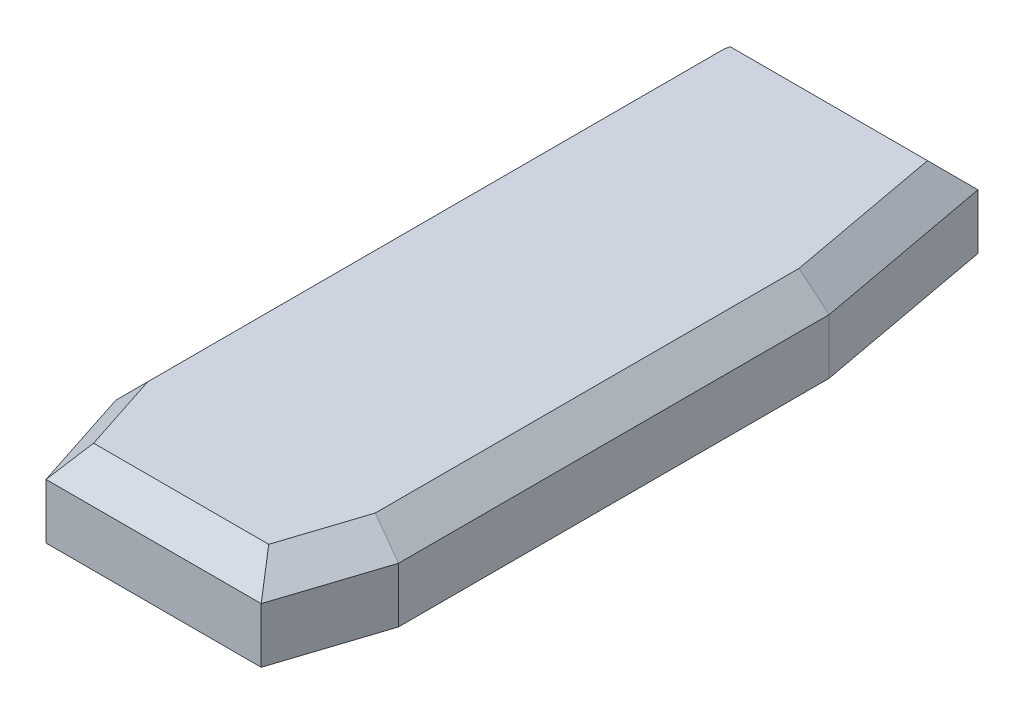
ISO-10303-21;
HEADER;
FILE_DESCRIPTION(('STEP AP214'),'2;1');
FILE_NAME('part.step','',(''),(''),'','','');
FILE_SCHEMA(('AUTOMOTIVE_DESIGN { 1 0 10303 214 1 1 1 1 }'));
ENDSEC;
DATA;
#1=APPLICATION_CONTEXT('core data for automotive mechanical design processes');
#2=APPLICATION_PROTOCOL_DEFINITION('international standard','automotive_design',2000,#1);
#3=PRODUCT_CONTEXT('',#1,'mechanical');
#4=PRODUCT('Part','Part','',(#3));
#5=PRODUCT_RELATED_PRODUCT_CATEGORY('part','',(#4));
#6=PRODUCT_DEFINITION_FORMATION('','',#4);
#7=PRODUCT_DEFINITION_CONTEXT('part definition',#1,'design');
#8=PRODUCT_DEFINITION('design','',#6,#7);
#9=PRODUCT_DEFINITION_SHAPE('','',#8);
#10=(LENGTH_UNIT() NAMED_UNIT(*) SI_UNIT(.MILLI.,.METRE.));
#11=(NAMED_UNIT(*) PLANE_ANGLE_UNIT() SI_UNIT($,.RADIAN.));
#12=(NAMED_UNIT(*) SI_UNIT($,.STERADIAN.) SOLID_ANGLE_UNIT());
#13=UNCERTAINTY_MEASURE_WITH_UNIT(LENGTH_MEASURE(1.E-05),#10,'distance_accuracy_value','');
#14=(GEOMETRIC_REPRESENTATION_CONTEXT(3) GLOBAL_UNCERTAINTY_ASSIGNED_CONTEXT((#13)) GLOBAL_UNIT_ASSIGNED_CONTEXT((#10,
#11,#12)) REPRESENTATION_CONTEXT('',''));
#15=CARTESIAN_POINT('',(0.,0.,0.));
#16=DIRECTION('',(0.,0.,1.));
#17=DIRECTION('',(1.,0.,0.));
#18=AXIS2_PLACEMENT_3D('',#15,#16,#17);
#19=CARTESIAN_POINT('',(-18.0555095571876,6.,-52.));
#20=DIRECTION('',(0.983392157291948,0.,0.18149342956892));
#21=DIRECTION('',(0.18149342956892,0.,-0.983392157291948));
#22=AXIS2_PLACEMENT_3D('',#19,#20,#21);
#23=PLANE('',#22);
#24=DIRECTION('',(-0.18149342956892,0.,0.983392157291948));
#25=VECTOR('',#24,1.);
#26=CARTESIAN_POINT('',(-18.0555095571876,6.,-52.));
#27=LINE('',#26,#25);
#28=CARTESIAN_POINT('',(-18.4246266550272,6.,-50.));
#29=VERTEX_POINT('',#28);
#30=CARTESIAN_POINT('',(-18.5,6.00000000000001,-49.5916019853108));
#31=VERTEX_POINT('',#30);
#32=EDGE_CURVE('E154',#29,#31,#27,.T.);
#33=ORIENTED_EDGE('',*,*,#32,.F.);
#34=DIRECTION('',(-0.129405307426086,0.701161274747102,0.7011612747471));
#35=VECTOR('',#34,1.);
#36=CARTESIAN_POINT('',(-18.1160927655662,4.32826010354525,-51.6717398964548));
#37=LINE('',#36,#35);
#38=CARTESIAN_POINT('',(-18.0555095571876,4.00000000000001,-52.));
#39=VERTEX_POINT('',#38);
#40=EDGE_CURVE('E199',#29,#39,#37,.F.);
#41=ORIENTED_EDGE('',*,*,#40,.T.);
#42=DIRECTION('',(0.,-1.,0.));
#43=VECTOR('',#42,1.);
#44=CARTESIAN_POINT('',(-18.0555095571876,6.,-52.));
#45=LINE('',#44,#43);
#46=CARTESIAN_POINT('',(-18.0555095571876,0.,-52.));
#47=VERTEX_POINT('',#46);
#48=EDGE_CURVE('E148',#39,#47,#45,.T.);
#49=ORIENTED_EDGE('',*,*,#48,.T.);
#50=DIRECTION('',(-0.18149342956892,0.,0.983392157291948));
#51=VECTOR('',#50,1.);
#52=CARTESIAN_POINT('',(-18.0555095571876,0.,-52.));
#53=LINE('',#52,#51);
#54=CARTESIAN_POINT('',(-20.5,0.,-38.7549324747099));
#55=VERTEX_POINT('',#54);
#56=EDGE_CURVE('E141',#47,#55,#53,.T.);
#57=ORIENTED_EDGE('',*,*,#56,.T.);
#58=DIRECTION('',(0.,-1.,0.));
#59=VECTOR('',#58,1.);
#60=CARTESIAN_POINT('',(-20.5,6.,-38.7549324747099));
#61=LINE('',#60,#59);
#62=CARTESIAN_POINT('',(-20.5,4.00000000000001,-38.7549324747099));
#63=VERTEX_POINT('',#62);
#64=EDGE_CURVE('E123',#63,#55,#61,.T.);
#65=ORIENTED_EDGE('',*,*,#64,.F.);
#66=DIRECTION('',(-0.178576122177072,-0.178576122177072,0.967585209258802));
#67=VECTOR('',#66,1.);
#68=CARTESIAN_POINT('',(-27.0688146085232,-2.56881460852318,-3.16289598022375));
#69=LINE('',#68,#67);
#70=EDGE_CURVE('E197',#63,#31,#69,.F.);
#71=ORIENTED_EDGE('',*,*,#70,.T.);
#72=EDGE_LOOP('',(#33,#41,#49,#57,#65,#71));
#73=FACE_BOUND('',#72,.T.);
#74=ADVANCED_FACE('F34',(#73),#23,.F.);
#75=CARTESIAN_POINT('',(-20.5,6.,-7.51056710569006));
#76=DIRECTION('',(1.,0.,0.));
#77=DIRECTION('',(0.,0.,-1.));
#78=AXIS2_PLACEMENT_3D('',#75,#76,#77);
#79=PLANE('',#78);
#80=DIRECTION('',(0.,-1.,0.));
#81=VECTOR('',#80,1.);
#82=CARTESIAN_POINT('',(-20.5,6.,-7.51056710569006));
#83=LINE('',#82,#81);
#84=CARTESIAN_POINT('',(-20.5,4.00000000000001,-7.51056710569006));
#85=VERTEX_POINT('',#84);
#86=CARTESIAN_POINT('',(-20.5,0.,-7.51056710569006));
#87=VERTEX_POINT('',#86);
#88=EDGE_CURVE('E135',#85,#87,#83,.T.);
#89=ORIENTED_EDGE('',*,*,#88,.F.);
#90=DIRECTION('',(0.,0.,-1.));
#91=VECTOR('',#90,1.);
#92=CARTESIAN_POINT('',(-20.5,4.00000000000001,-7.51056710569006));
#93=LINE('',#92,#91);
#94=EDGE_CURVE('E130',#85,#63,#93,.T.);
#95=ORIENTED_EDGE('',*,*,#94,.T.);
#96=ORIENTED_EDGE('',*,*,#64,.T.);
#97=DIRECTION('',(0.,0.,1.));
#98=VECTOR('',#97,1.);
#99=CARTESIAN_POINT('',(-20.5,0.,-7.51056710569006));
#100=LINE('',#99,#98);
#101=EDGE_CURVE('E127',#55,#87,#100,.T.);
#102=ORIENTED_EDGE('',*,*,#101,.T.);
#103=EDGE_LOOP('',(#89,#95,#96,#102));
#104=FACE_BOUND('',#103,.T.);
#105=ADVANCED_FACE('F126',(#104),#79,.F.);
#106=CARTESIAN_POINT('',(-20.5,6.,-7.51056710569006));
#107=DIRECTION('',(0.950901633838052,0.,-0.309493267720192));
#108=DIRECTION('',(-0.309493267720192,0.,-0.950901633838052));
#109=AXIS2_PLACEMENT_3D('',#106,#107,#108);
#110=PLANE('',#109);
#111=DIRECTION('',(0.,-1.,0.));
#112=VECTOR('',#111,1.);
#113=CARTESIAN_POINT('',(-18.0555095571876,6.,0.));
#114=LINE('',#113,#112);
#115=CARTESIAN_POINT('',(-18.0555095571876,4.00000000000001,0.));
#116=VERTEX_POINT('',#115);
#117=CARTESIAN_POINT('',(-18.0555095571876,0.,0.));
#118=VERTEX_POINT('',#117);
#119=EDGE_CURVE('E180',#116,#118,#114,.T.);
#120=ORIENTED_EDGE('',*,*,#119,.F.);
#121=DIRECTION('',(-0.309493267720192,0.,-0.950901633838052));
#122=VECTOR('',#121,1.);
#123=CARTESIAN_POINT('',(-20.5,4.00000000000001,-7.51056710569006));
#124=LINE('',#123,#122);
#125=EDGE_CURVE('E208',#116,#85,#124,.T.);
#126=ORIENTED_EDGE('',*,*,#125,.T.);
#127=ORIENTED_EDGE('',*,*,#88,.T.);
#128=DIRECTION('',(0.309493267720192,0.,0.950901633838052));
#129=VECTOR('',#128,1.);
#130=CARTESIAN_POINT('',(-20.5,0.,-7.51056710569006));
#131=LINE('',#130,#129);
#132=EDGE_CURVE('E144',#87,#118,#131,.T.);
#133=ORIENTED_EDGE('',*,*,#132,.T.);
#134=EDGE_LOOP('',(#120,#126,#127,#133));
#135=FACE_BOUND('',#134,.T.);
#136=ADVANCED_FACE('F234',(#135),#110,.F.);
#137=CARTESIAN_POINT('',(-2.44449044281239,6.,0.));
#138=DIRECTION('',(0.,0.,-1.));
#139=DIRECTION('',(-1.,0.,0.));
#140=AXIS2_PLACEMENT_3D('',#137,#138,#139);
#141=PLANE('',#140);
#142=DIRECTION('',(0.,-1.,0.));
#143=VECTOR('',#142,1.);
#144=CARTESIAN_POINT('',(-2.44449044281239,6.,0.));
#145=LINE('',#144,#143);
#146=CARTESIAN_POINT('',(-2.44449044281239,4.00000000000001,0.));
#147=VERTEX_POINT('',#146);
#148=CARTESIAN_POINT('',(-2.44449044281239,0.,0.));
#149=VERTEX_POINT('',#148);
#150=EDGE_CURVE('E178',#147,#149,#145,.T.);
#151=ORIENTED_EDGE('',*,*,#150,.F.);
#152=DIRECTION('',(-1.,0.,0.));
#153=VECTOR('',#152,1.);
#154=CARTESIAN_POINT('',(-2.44449044281239,4.00000000000001,0.));
#155=LINE('',#154,#153);
#156=EDGE_CURVE('E11',#147,#116,#155,.T.);
#157=ORIENTED_EDGE('',*,*,#156,.T.);
#158=ORIENTED_EDGE('',*,*,#119,.T.);
#159=DIRECTION('',(1.,0.,0.));
#160=VECTOR('',#159,1.);
#161=CARTESIAN_POINT('',(-2.44449044281239,0.,0.));
#162=LINE('',#161,#160);
#163=EDGE_CURVE('E157',#118,#149,#162,.T.);
#164=ORIENTED_EDGE('',*,*,#163,.T.);
#165=EDGE_LOOP('',(#151,#157,#158,#164));
#166=FACE_BOUND('',#165,.T.);
#167=ADVANCED_FACE('F260',(#166),#141,.F.);
#168=CARTESIAN_POINT('',(0.,6.,-7.51056710569009));
#169=DIRECTION('',(-0.950901633838052,0.,-0.309493267720192));
#170=DIRECTION('',(-0.309493267720192,0.,0.950901633838052));
#171=AXIS2_PLACEMENT_3D('',#168,#169,#170);
#172=PLANE('',#171);
#173=DIRECTION('',(0.,-1.,0.));
#174=VECTOR('',#173,1.);
#175=CARTESIAN_POINT('',(0.,6.,-7.51056710569009));
#176=LINE('',#175,#174);
#177=CARTESIAN_POINT('',(0.,4.00000000000001,-7.51056710569009));
#178=VERTEX_POINT('',#177);
#179=CARTESIAN_POINT('',(0.,0.,-7.51056710569009));
#180=VERTEX_POINT('',#179);
#181=EDGE_CURVE('E176',#178,#180,#176,.T.);
#182=ORIENTED_EDGE('',*,*,#181,.F.);
#183=DIRECTION('',(-0.309493267720192,0.,0.950901633838052));
#184=VECTOR('',#183,1.);
#185=CARTESIAN_POINT('',(0.,4.,-7.51056710569009));
#186=LINE('',#185,#184);
#187=EDGE_CURVE('E43',#178,#147,#186,.T.);
#188=ORIENTED_EDGE('',*,*,#187,.T.);
#189=ORIENTED_EDGE('',*,*,#150,.T.);
#190=DIRECTION('',(0.309493267720192,0.,-0.950901633838052));
#191=VECTOR('',#190,1.);
#192=CARTESIAN_POINT('',(0.,0.,-7.51056710569009));
#193=LINE('',#192,#191);
#194=EDGE_CURVE('E160',#149,#180,#193,.T.);
#195=ORIENTED_EDGE('',*,*,#194,.T.);
#196=EDGE_LOOP('',(#182,#188,#189,#195));
#197=FACE_BOUND('',#196,.T.);
#198=ADVANCED_FACE('F259',(#197),#172,.F.);
#199=CARTESIAN_POINT('',(0.,6.,-38.7549324747099));
#200=DIRECTION('',(-1.,0.,0.));
#201=DIRECTION('',(0.,0.,1.));
#202=AXIS2_PLACEMENT_3D('',#199,#200,#201);
#203=PLANE('',#202);
#204=DIRECTION('',(0.,-1.,0.));
#205=VECTOR('',#204,1.);
#206=CARTESIAN_POINT('',(0.,6.,-38.7549324747099));
#207=LINE('',#206,#205);
#208=CARTESIAN_POINT('',(0.,4.00000000000001,-38.7549324747099));
#209=VERTEX_POINT('',#208);
#210=CARTESIAN_POINT('',(0.,0.,-38.7549324747099));
#211=VERTEX_POINT('',#210);
#212=EDGE_CURVE('E174',#209,#211,#207,.T.);
#213=ORIENTED_EDGE('',*,*,#212,.F.);
#214=DIRECTION('',(0.,0.,1.));
#215=VECTOR('',#214,1.);
#216=CARTESIAN_POINT('',(0.,4.00000000000001,-38.7549324747099));
#217=LINE('',#216,#215);
#218=EDGE_CURVE('E206',#209,#178,#217,.T.);
#219=ORIENTED_EDGE('',*,*,#218,.T.);
#220=ORIENTED_EDGE('',*,*,#181,.T.);
#221=DIRECTION('',(0.,0.,-1.));
#222=VECTOR('',#221,1.);
#223=CARTESIAN_POINT('',(0.,0.,-38.7549324747099));
#224=LINE('',#223,#222);
#225=EDGE_CURVE('E163',#180,#211,#224,.T.);
#226=ORIENTED_EDGE('',*,*,#225,.T.);
#227=EDGE_LOOP('',(#213,#219,#220,#226));
#228=FACE_BOUND('',#227,.T.);
#229=ADVANCED_FACE('F258',(#228),#203,.F.);
#230=CARTESIAN_POINT('',(-2.44449044281239,6.,-52.));
#231=DIRECTION('',(-0.983392157291948,0.,0.18149342956892));
#232=DIRECTION('',(0.18149342956892,0.,0.983392157291948));
#233=AXIS2_PLACEMENT_3D('',#230,#231,#232);
#234=PLANE('',#233);
#235=DIRECTION('',(0.,-1.,0.));
#236=VECTOR('',#235,1.);
#237=CARTESIAN_POINT('',(-2.44449044281239,6.,-52.));
#238=LINE('',#237,#236);
#239=CARTESIAN_POINT('',(-2.44449044281239,4.00000000000001,-52.));
#240=VERTEX_POINT('',#239);
#241=CARTESIAN_POINT('',(-2.44449044281239,0.,-52.));
#242=VERTEX_POINT('',#241);
#243=EDGE_CURVE('E172',#240,#242,#238,.T.);
#244=ORIENTED_EDGE('',*,*,#243,.F.);
#245=DIRECTION('',(0.18149342956892,0.,0.983392157291948));
#246=VECTOR('',#245,1.);
#247=CARTESIAN_POINT('',(-2.44449044281239,4.,-52.));
#248=LINE('',#247,#246);
#249=EDGE_CURVE('E203',#240,#209,#248,.T.);
#250=ORIENTED_EDGE('',*,*,#249,.T.);
#251=ORIENTED_EDGE('',*,*,#212,.T.);
#252=DIRECTION('',(-0.18149342956892,0.,-0.983392157291948));
#253=VECTOR('',#252,1.);
#254=CARTESIAN_POINT('',(-2.44449044281239,0.,-52.));
#255=LINE('',#254,#253);
#256=EDGE_CURVE('E166',#211,#242,#255,.T.);
#257=ORIENTED_EDGE('',*,*,#256,.T.);
#258=EDGE_LOOP('',(#244,#250,#251,#257));
#259=FACE_BOUND('',#258,.T.);
#260=ADVANCED_FACE('F253',(#259),#234,.F.);
#261=CARTESIAN_POINT('',(-18.0555095571876,6.,-52.));
#262=DIRECTION('',(0.,0.,1.));
#263=DIRECTION('',(1.,0.,0.));
#264=AXIS2_PLACEMENT_3D('',#261,#262,#263);
#265=PLANE('',#264);
#266=ORIENTED_EDGE('',*,*,#48,.F.);
#267=DIRECTION('',(1.,0.,0.));
#268=VECTOR('',#267,1.);
#269=CARTESIAN_POINT('',(-18.0555095571876,4.00000000000001,-52.));
#270=LINE('',#269,#268);
#271=EDGE_CURVE('E201',#39,#240,#270,.T.);
#272=ORIENTED_EDGE('',*,*,#271,.T.);
#273=ORIENTED_EDGE('',*,*,#243,.T.);
#274=DIRECTION('',(-1.,0.,0.));
#275=VECTOR('',#274,1.);
#276=CARTESIAN_POINT('',(-18.0555095571876,0.,-52.));
#277=LINE('',#276,#275);
#278=EDGE_CURVE('E169',#242,#47,#277,.T.);
#279=ORIENTED_EDGE('',*,*,#278,.T.);
#280=EDGE_LOOP('',(#266,#272,#273,#279));
#281=FACE_BOUND('',#280,.T.);
#282=ADVANCED_FACE('F247',(#281),#265,.F.);
#283=CARTESIAN_POINT('',(0.,6.,0.));
#284=DIRECTION('',(0.,-1.,0.));
#285=DIRECTION('',(0.,0.,-1.));
#286=AXIS2_PLACEMENT_3D('',#283,#284,#285);
#287=PLANE('',#286);
#288=DIRECTION('',(-0.18149342956892,0.,-0.983392157291948));
#289=VECTOR('',#288,1.);
#290=CARTESIAN_POINT('',(4.95016562010768,6.,-0.913595383759788));
#291=LINE('',#290,#289);
#292=CARTESIAN_POINT('',(-1.99999999999999,6.,-38.5719193182833));
#293=VERTEX_POINT('',#292);
#294=CARTESIAN_POINT('',(-4.1091499875561,6.,-50.));
#295=VERTEX_POINT('',#294);
#296=EDGE_CURVE('E192',#293,#295,#291,.T.);
#297=ORIENTED_EDGE('',*,*,#296,.T.);
#298=DIRECTION('',(-1.,0.,0.));
#299=VECTOR('',#298,1.);
#300=CARTESIAN_POINT('',(0.,6.,-50.));
#301=LINE('',#300,#299);
#302=EDGE_CURVE('E194',#295,#29,#301,.T.);
#303=ORIENTED_EDGE('',*,*,#302,.T.);
#304=ORIENTED_EDGE('',*,*,#32,.T.);
#305=DIRECTION('',(0.,0.,1.));
#306=VECTOR('',#305,1.);
#307=CARTESIAN_POINT('',(-18.5,6.,0.));
#308=LINE('',#307,#306);
#309=CARTESIAN_POINT('',(-18.5,6.,-7.82784939440425));
#310=VERTEX_POINT('',#309);
#311=EDGE_CURVE('E190',#31,#310,#308,.T.);
#312=ORIENTED_EDGE('',*,*,#311,.T.);
#313=DIRECTION('',(0.309493267720192,0.,0.950901633838052));
#314=VECTOR('',#313,1.);
#315=CARTESIAN_POINT('',(-14.4242397567183,6.,4.69470756787717));
#316=LINE('',#315,#314);
#317=CARTESIAN_POINT('',(-16.6031895532924,6.,-1.99999999999999));
#318=VERTEX_POINT('',#317);
#319=EDGE_CURVE('E186',#310,#318,#316,.T.);
#320=ORIENTED_EDGE('',*,*,#319,.T.);
#321=DIRECTION('',(1.,0.,0.));
#322=VECTOR('',#321,1.);
#323=CARTESIAN_POINT('',(0.,6.,-2.00000000000002));
#324=LINE('',#323,#322);
#325=CARTESIAN_POINT('',(-3.89681044670756,6.,-2.00000000000001));
#326=VERTEX_POINT('',#325);
#327=EDGE_CURVE('E134',#318,#326,#324,.T.);
#328=ORIENTED_EDGE('',*,*,#327,.T.);
#329=DIRECTION('',(0.309493267720192,0.,-0.950901633838052));
#330=VECTOR('',#329,1.);
#331=CARTESIAN_POINT('',(-4.11214554661716,6.,-1.33839433783151));
#332=LINE('',#331,#330);
#333=CARTESIAN_POINT('',(-1.99999999999999,6.,-7.82784939440428));
#334=VERTEX_POINT('',#333);
#335=EDGE_CURVE('E184',#326,#334,#332,.T.);
#336=ORIENTED_EDGE('',*,*,#335,.T.);
#337=DIRECTION('',(0.,0.,-1.));
#338=VECTOR('',#337,1.);
#339=CARTESIAN_POINT('',(-1.99999999999999,6.,0.));
#340=LINE('',#339,#338);
#341=EDGE_CURVE('E188',#334,#293,#340,.T.);
#342=ORIENTED_EDGE('',*,*,#341,.T.);
#343=EDGE_LOOP('',(#297,#303,#304,#312,#320,#328,#336,#342));
#344=FACE_BOUND('',#343,.T.);
#345=ADVANCED_FACE('F239',(#344),#287,.F.);
#346=CARTESIAN_POINT('',(0.,0.,0.));
#347=DIRECTION('',(0.,-1.,0.));
#348=DIRECTION('',(0.,0.,-1.));
#349=AXIS2_PLACEMENT_3D('',#346,#347,#348);
#350=PLANE('',#349);
#351=ORIENTED_EDGE('',*,*,#56,.F.);
#352=ORIENTED_EDGE('',*,*,#278,.F.);
#353=ORIENTED_EDGE('',*,*,#256,.F.);
#354=ORIENTED_EDGE('',*,*,#225,.F.);
#355=ORIENTED_EDGE('',*,*,#194,.F.);
#356=ORIENTED_EDGE('',*,*,#163,.F.);
#357=ORIENTED_EDGE('',*,*,#132,.F.);
#358=ORIENTED_EDGE('',*,*,#101,.F.);
#359=EDGE_LOOP('',(#351,#352,#353,#354,#355,#356,#357,#358));
#360=FACE_BOUND('',#359,.T.);
#361=ADVANCED_FACE('F139',(#360),#350,.T.);
#362=CARTESIAN_POINT('',(-18.5,6.,0.));
#363=DIRECTION('',(0.707106781186549,-0.707106781186546,0.));
#364=DIRECTION('',(0.,0.,1.));
#365=AXIS2_PLACEMENT_3D('',#362,#363,#364);
#366=PLANE('',#365);
#367=ORIENTED_EDGE('',*,*,#70,.F.);
#368=ORIENTED_EDGE('',*,*,#94,.F.);
#369=DIRECTION('',(-0.702699391817417,-0.70269939181742,0.111477035656948));
#370=VECTOR('',#369,1.);
#371=CARTESIAN_POINT('',(-17.4683974391126,7.03160256088744,-7.99150400518513));
#372=LINE('',#371,#370);
#373=EDGE_CURVE('E38',#310,#85,#372,.T.);
#374=ORIENTED_EDGE('',*,*,#373,.F.);
#375=ORIENTED_EDGE('',*,*,#311,.F.);
#376=EDGE_LOOP('',(#367,#368,#374,#375));
#377=FACE_BOUND('',#376,.T.);
#378=ADVANCED_FACE('F36',(#377),#366,.F.);
#379=CARTESIAN_POINT('',(-14.4242397567183,6.,4.69470756787717));
#380=DIRECTION('',(0.672388993528256,-0.707106781186546,-0.218844788336532));
#381=DIRECTION('',(0.309493267720192,0.,0.950901633838052));
#382=AXIS2_PLACEMENT_3D('',#379,#380,#381);
#383=PLANE('',#382);
#384=ORIENTED_EDGE('',*,*,#373,.T.);
#385=ORIENTED_EDGE('',*,*,#125,.F.);
#386=DIRECTION('',(-0.456775926958323,-0.629029312731675,0.629029312731674));
#387=VECTOR('',#386,1.);
#388=CARTESIAN_POINT('',(-13.1390295636987,10.7705188667825,-6.77051886678243));
#389=LINE('',#388,#387);
#390=EDGE_CURVE('E152',#318,#116,#389,.T.);
#391=ORIENTED_EDGE('',*,*,#390,.F.);
#392=ORIENTED_EDGE('',*,*,#319,.F.);
#393=EDGE_LOOP('',(#384,#385,#391,#392));
#394=FACE_BOUND('',#393,.T.);
#395=ADVANCED_FACE('F231',(#394),#383,.F.);
#396=CARTESIAN_POINT('',(0.,6.,-2.00000000000002));
#397=DIRECTION('',(0.,-0.707106781186546,-0.707106781186549));
#398=DIRECTION('',(1.,0.,0.));
#399=AXIS2_PLACEMENT_3D('',#396,#397,#398);
#400=PLANE('',#399);
#401=ORIENTED_EDGE('',*,*,#390,.T.);
#402=ORIENTED_EDGE('',*,*,#156,.F.);
#403=DIRECTION('',(-0.456775926958324,0.629029312731675,-0.629029312731672));
#404=VECTOR('',#403,1.);
#405=CARTESIAN_POINT('',(-3.08376336360428,4.8803471949396,-0.880347194939621));
#406=LINE('',#405,#404);
#407=EDGE_CURVE('E220',#326,#147,#406,.F.);
#408=ORIENTED_EDGE('',*,*,#407,.F.);
#409=ORIENTED_EDGE('',*,*,#327,.F.);
#410=EDGE_LOOP('',(#401,#402,#408,#409));
#411=FACE_BOUND('',#410,.T.);
#412=ADVANCED_FACE('F226',(#411),#400,.F.);
#413=CARTESIAN_POINT('',(-4.11214554661716,6.,-1.33839433783151));
#414=DIRECTION('',(-0.672388993528255,-0.707106781186546,-0.218844788336532));
#415=DIRECTION('',(0.309493267720192,0.,-0.950901633838052));
#416=AXIS2_PLACEMENT_3D('',#413,#414,#415);
#417=PLANE('',#416);
#418=ORIENTED_EDGE('',*,*,#407,.T.);
#419=ORIENTED_EDGE('',*,*,#187,.F.);
#420=DIRECTION('',(-0.702699391817417,0.70269939181742,-0.111477035656949));
#421=VECTOR('',#420,1.);
#422=CARTESIAN_POINT('',(-2.53459836320078,6.53459836320079,-7.91265869051388));
#423=LINE('',#422,#421);
#424=EDGE_CURVE('E217',#334,#178,#423,.F.);
#425=ORIENTED_EDGE('',*,*,#424,.F.);
#426=ORIENTED_EDGE('',*,*,#335,.F.);
#427=EDGE_LOOP('',(#418,#419,#425,#426));
#428=FACE_BOUND('',#427,.T.);
#429=ADVANCED_FACE('F285',(#428),#417,.F.);
#430=CARTESIAN_POINT('',(-1.99999999999999,6.,0.));
#431=DIRECTION('',(-0.707106781186549,-0.707106781186546,0.));
#432=DIRECTION('',(0.,0.,-1.));
#433=AXIS2_PLACEMENT_3D('',#430,#431,#432);
#434=PLANE('',#433);
#435=ORIENTED_EDGE('',*,*,#424,.T.);
#436=ORIENTED_EDGE('',*,*,#218,.F.);
#437=DIRECTION('',(-0.70563118152204,0.705631181522042,0.0645698949017034));
#438=VECTOR('',#437,1.);
#439=CARTESIAN_POINT('',(-3.75743427854968,7.7574342785497,-38.4111025210184));
#440=LINE('',#439,#438);
#441=EDGE_CURVE('E214',#293,#209,#440,.F.);
#442=ORIENTED_EDGE('',*,*,#441,.F.);
#443=ORIENTED_EDGE('',*,*,#341,.F.);
#444=EDGE_LOOP('',(#435,#436,#442,#443));
#445=FACE_BOUND('',#444,.T.);
#446=ADVANCED_FACE('F281',(#445),#434,.F.);
#447=CARTESIAN_POINT('',(4.95016562010768,6.,-0.913595383759788));
#448=DIRECTION('',(-0.695363262986806,-0.707106781186546,0.128335234788987));
#449=DIRECTION('',(-0.18149342956892,0.,-0.983392157291948));
#450=AXIS2_PLACEMENT_3D('',#447,#448,#449);
#451=PLANE('',#450);
#452=ORIENTED_EDGE('',*,*,#441,.T.);
#453=ORIENTED_EDGE('',*,*,#249,.F.);
#454=DIRECTION('',(-0.507219065608366,0.609396758886761,0.609396758886759));
#455=VECTOR('',#454,1.);
#456=CARTESIAN_POINT('',(-16.9509417074667,21.4287304697943,-34.5712695302058));
#457=LINE('',#456,#455);
#458=EDGE_CURVE('E211',#295,#240,#457,.F.);
#459=ORIENTED_EDGE('',*,*,#458,.F.);
#460=ORIENTED_EDGE('',*,*,#296,.F.);
#461=EDGE_LOOP('',(#452,#453,#459,#460));
#462=FACE_BOUND('',#461,.T.);
#463=ADVANCED_FACE('F278',(#462),#451,.F.);
#464=CARTESIAN_POINT('',(0.,6.,-50.));
#465=DIRECTION('',(0.,-0.707106781186546,0.707106781186549));
#466=DIRECTION('',(-1.,0.,0.));
#467=AXIS2_PLACEMENT_3D('',#464,#465,#466);
#468=PLANE('',#467);
#469=ORIENTED_EDGE('',*,*,#458,.T.);
#470=ORIENTED_EDGE('',*,*,#271,.F.);
#471=ORIENTED_EDGE('',*,*,#40,.F.);
#472=ORIENTED_EDGE('',*,*,#302,.F.);
#473=EDGE_LOOP('',(#469,#470,#471,#472));
#474=FACE_BOUND('',#473,.T.);
#475=ADVANCED_FACE('F244',(#474),#468,.F.);
#476=CLOSED_SHELL('',(#74,#105,#136,#167,#198,#229,#260,#282,#345,#361,#378,#395,#412,#429,#446,
#463,#475));
#477=MANIFOLD_SOLID_BREP('B2',#476);
#478=ADVANCED_BREP_SHAPE_REPRESENTATION('',(#18,#477),#14);
#479=SHAPE_DEFINITION_REPRESENTATION(#9,#478);
ENDSEC;
END-ISO-10303-21;
